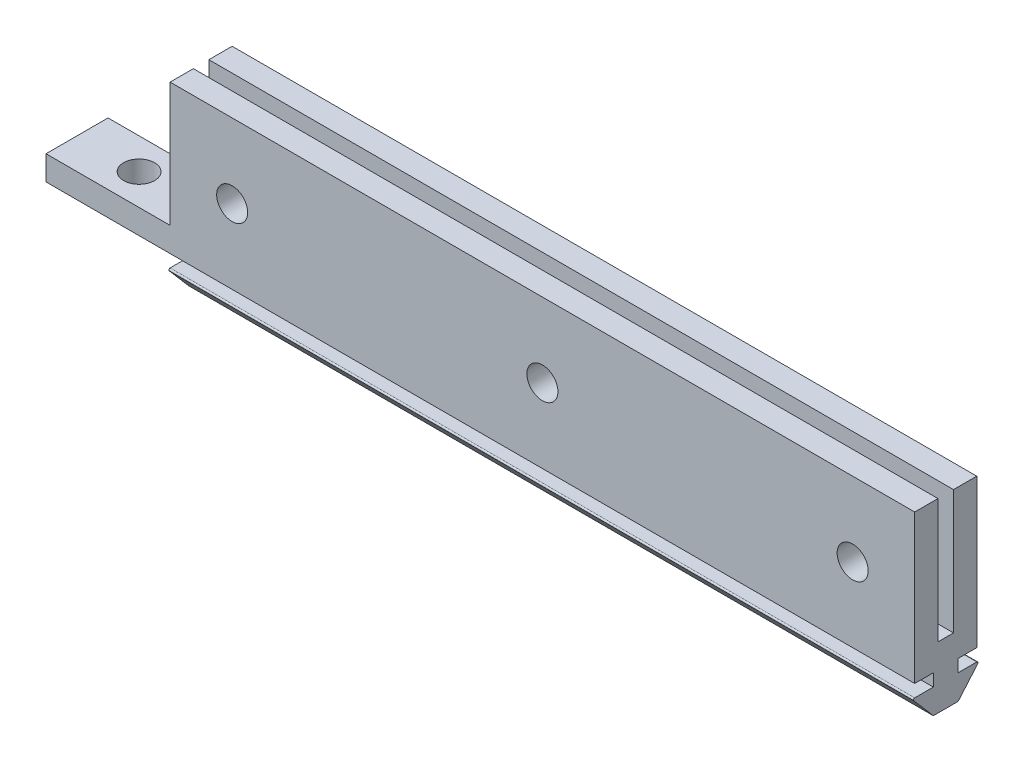
ISO-10303-21;
HEADER;
FILE_DESCRIPTION(('STEP AP214'),'2;1');
FILE_NAME('part.step','',(''),(''),'','','');
FILE_SCHEMA(('AUTOMOTIVE_DESIGN { 1 0 10303 214 1 1 1 1 }'));
ENDSEC;
DATA;
#1=APPLICATION_CONTEXT('core data for automotive mechanical design processes');
#2=APPLICATION_PROTOCOL_DEFINITION('international standard','automotive_design',2000,#1);
#3=PRODUCT_CONTEXT('',#1,'mechanical');
#4=PRODUCT('Part','Part','',(#3));
#5=PRODUCT_RELATED_PRODUCT_CATEGORY('part','',(#4));
#6=PRODUCT_DEFINITION_FORMATION('','',#4);
#7=PRODUCT_DEFINITION_CONTEXT('part definition',#1,'design');
#8=PRODUCT_DEFINITION('design','',#6,#7);
#9=PRODUCT_DEFINITION_SHAPE('','',#8);
#10=(LENGTH_UNIT() NAMED_UNIT(*) SI_UNIT(.MILLI.,.METRE.));
#11=(NAMED_UNIT(*) PLANE_ANGLE_UNIT() SI_UNIT($,.RADIAN.));
#12=(NAMED_UNIT(*) SI_UNIT($,.STERADIAN.) SOLID_ANGLE_UNIT());
#13=UNCERTAINTY_MEASURE_WITH_UNIT(LENGTH_MEASURE(1.E-05),#10,'distance_accuracy_value','');
#14=(GEOMETRIC_REPRESENTATION_CONTEXT(3) GLOBAL_UNCERTAINTY_ASSIGNED_CONTEXT((#13)) GLOBAL_UNIT_ASSIGNED_CONTEXT((#10,
#11,#12)) REPRESENTATION_CONTEXT('',''));
#15=CARTESIAN_POINT('',(0.,0.,0.));
#16=DIRECTION('',(0.,0.,1.));
#17=DIRECTION('',(1.,0.,0.));
#18=AXIS2_PLACEMENT_3D('',#15,#16,#17);
#19=CARTESIAN_POINT('',(-152.4,5.08,0.));
#20=DIRECTION('',(0.,1.,0.));
#21=DIRECTION('',(0.,0.,1.));
#22=AXIS2_PLACEMENT_3D('',#19,#20,#21);
#23=PLANE('',#22);
#24=DIRECTION('',(0.,0.,1.));
#25=VECTOR('',#24,1.);
#26=CARTESIAN_POINT('',(0.,5.08,0.));
#27=LINE('',#26,#25);
#28=CARTESIAN_POINT('',(0.,5.08,-2.54));
#29=VERTEX_POINT('',#28);
#30=CARTESIAN_POINT('',(0.,5.08,2.54));
#31=VERTEX_POINT('',#30);
#32=EDGE_CURVE('E169',#29,#31,#27,.T.);
#33=ORIENTED_EDGE('',*,*,#32,.T.);
#34=DIRECTION('',(1.,0.,0.));
#35=VECTOR('',#34,1.);
#36=CARTESIAN_POINT('',(-152.4,5.08,2.54));
#37=LINE('',#36,#35);
#38=CARTESIAN_POINT('',(-152.4,5.08,2.54));
#39=VERTEX_POINT('',#38);
#40=EDGE_CURVE('E52',#39,#31,#37,.T.);
#41=ORIENTED_EDGE('',*,*,#40,.F.);
#42=DIRECTION('',(0.,0.,1.));
#43=VECTOR('',#42,1.);
#44=CARTESIAN_POINT('',(-152.4,5.08,0.));
#45=LINE('',#44,#43);
#46=CARTESIAN_POINT('',(-152.4,5.08,-2.54));
#47=VERTEX_POINT('',#46);
#48=EDGE_CURVE('E69',#47,#39,#45,.T.);
#49=ORIENTED_EDGE('',*,*,#48,.F.);
#50=DIRECTION('',(1.,0.,0.));
#51=VECTOR('',#50,1.);
#52=CARTESIAN_POINT('',(-152.4,5.08,-2.54));
#53=LINE('',#52,#51);
#54=EDGE_CURVE('E168',#47,#29,#53,.T.);
#55=ORIENTED_EDGE('',*,*,#54,.T.);
#56=EDGE_LOOP('',(#33,#41,#49,#55));
#57=FACE_BOUND('',#56,.T.);
#58=ADVANCED_FACE('F43',(#57),#23,.F.);
#59=CARTESIAN_POINT('',(-152.4,0.90103385496104,-1.04911404967848));
#60=DIRECTION('',(0.,-0.651538564289137,0.758615514766241));
#61=DIRECTION('',(0.,-0.758615514766242,-0.651538564289137));
#62=AXIS2_PLACEMENT_3D('',#59,#60,#61);
#63=PLANE('',#62);
#64=DIRECTION('',(0.,-0.758615514766242,-0.651538564289137));
#65=VECTOR('',#64,1.);
#66=CARTESIAN_POINT('',(0.,0.90103385496104,-1.04911404967848));
#67=LINE('',#66,#65);
#68=CARTESIAN_POINT('',(0.,9.74050920467056,6.54268834075063));
#69=VERTEX_POINT('',#68);
#70=EDGE_CURVE('E196',#69,#31,#67,.T.);
#71=ORIENTED_EDGE('',*,*,#70,.F.);
#72=DIRECTION('',(1.,0.,0.));
#73=VECTOR('',#72,1.);
#74=CARTESIAN_POINT('',(-152.4,9.74050920467056,6.54268834075063));
#75=LINE('',#74,#73);
#76=CARTESIAN_POINT('',(-152.4,9.74050920467056,6.54268834075063));
#77=VERTEX_POINT('',#76);
#78=EDGE_CURVE('E146',#77,#69,#75,.T.);
#79=ORIENTED_EDGE('',*,*,#78,.F.);
#80=DIRECTION('',(0.,-0.758615514766242,-0.651538564289137));
#81=VECTOR('',#80,1.);
#82=CARTESIAN_POINT('',(-152.4,0.90103385496104,-1.04911404967848));
#83=LINE('',#82,#81);
#84=EDGE_CURVE('E154',#77,#39,#83,.T.);
#85=ORIENTED_EDGE('',*,*,#84,.T.);
#86=ORIENTED_EDGE('',*,*,#40,.T.);
#87=EDGE_LOOP('',(#71,#79,#85,#86));
#88=FACE_BOUND('',#87,.T.);
#89=ADVANCED_FACE('F395',(#88),#63,.T.);
#90=CARTESIAN_POINT('',(-152.4,9.906,6.35));
#91=DIRECTION('',(1.,0.,0.));
#92=DIRECTION('',(0.,0.,-1.));
#93=AXIS2_PLACEMENT_3D('',#90,#91,#92);
#94=CYLINDRICAL_SURFACE('',#93,0.254);
#95=CARTESIAN_POINT('',(0.,9.906,6.35));
#96=DIRECTION('',(1.,0.,0.));
#97=DIRECTION('',(0.,0.,-1.));
#98=AXIS2_PLACEMENT_3D('',#95,#96,#97);
#99=CIRCLE('',#98,0.254);
#100=CARTESIAN_POINT('',(0.,10.16,6.35));
#101=VERTEX_POINT('',#100);
#102=EDGE_CURVE('E140',#101,#69,#99,.T.);
#103=ORIENTED_EDGE('',*,*,#102,.F.);
#104=DIRECTION('',(1.,0.,0.));
#105=VECTOR('',#104,1.);
#106=CARTESIAN_POINT('',(-152.4,10.16,6.35));
#107=LINE('',#106,#105);
#108=CARTESIAN_POINT('',(-152.4,10.16,6.35));
#109=VERTEX_POINT('',#108);
#110=EDGE_CURVE('E135',#109,#101,#107,.T.);
#111=ORIENTED_EDGE('',*,*,#110,.F.);
#112=CARTESIAN_POINT('',(-152.4,9.906,6.35));
#113=DIRECTION('',(1.,0.,0.));
#114=DIRECTION('',(0.,0.,-1.));
#115=AXIS2_PLACEMENT_3D('',#112,#113,#114);
#116=CIRCLE('',#115,0.254);
#117=EDGE_CURVE('E138',#109,#77,#116,.T.);
#118=ORIENTED_EDGE('',*,*,#117,.T.);
#119=ORIENTED_EDGE('',*,*,#78,.T.);
#120=EDGE_LOOP('',(#103,#111,#118,#119));
#121=FACE_BOUND('',#120,.T.);
#122=ADVANCED_FACE('F137',(#121),#94,.T.);
#123=CARTESIAN_POINT('',(-152.4,10.16,0.));
#124=DIRECTION('',(0.,1.,0.));
#125=DIRECTION('',(0.,0.,1.));
#126=AXIS2_PLACEMENT_3D('',#123,#124,#125);
#127=PLANE('',#126);
#128=DIRECTION('',(0.,0.,1.));
#129=VECTOR('',#128,1.);
#130=CARTESIAN_POINT('',(0.,10.16,0.));
#131=LINE('',#130,#129);
#132=CARTESIAN_POINT('',(0.,10.16,2.54));
#133=VERTEX_POINT('',#132);
#134=EDGE_CURVE('E191',#133,#101,#131,.T.);
#135=ORIENTED_EDGE('',*,*,#134,.F.);
#136=DIRECTION('',(1.,0.,0.));
#137=VECTOR('',#136,1.);
#138=CARTESIAN_POINT('',(-152.4,10.16,2.54));
#139=LINE('',#138,#137);
#140=CARTESIAN_POINT('',(-152.4,10.16,2.54));
#141=VERTEX_POINT('',#140);
#142=EDGE_CURVE('E147',#141,#133,#139,.T.);
#143=ORIENTED_EDGE('',*,*,#142,.F.);
#144=DIRECTION('',(0.,0.,1.));
#145=VECTOR('',#144,1.);
#146=CARTESIAN_POINT('',(-152.4,10.16,0.));
#147=LINE('',#146,#145);
#148=EDGE_CURVE('E152',#141,#109,#147,.T.);
#149=ORIENTED_EDGE('',*,*,#148,.T.);
#150=ORIENTED_EDGE('',*,*,#110,.T.);
#151=EDGE_LOOP('',(#135,#143,#149,#150));
#152=FACE_BOUND('',#151,.T.);
#153=ADVANCED_FACE('F157',(#152),#127,.T.);
#154=CARTESIAN_POINT('',(-152.4,0.,2.54));
#155=DIRECTION('',(0.,0.,1.));
#156=DIRECTION('',(1.,0.,0.));
#157=AXIS2_PLACEMENT_3D('',#154,#155,#156);
#158=PLANE('',#157);
#159=DIRECTION('',(0.,-1.,0.));
#160=VECTOR('',#159,1.);
#161=CARTESIAN_POINT('',(0.,0.,2.54));
#162=LINE('',#161,#160);
#163=CARTESIAN_POINT('',(0.,12.7,2.54));
#164=VERTEX_POINT('',#163);
#165=EDGE_CURVE('E187',#164,#133,#162,.T.);
#166=ORIENTED_EDGE('',*,*,#165,.F.);
#167=DIRECTION('',(1.,0.,0.));
#168=VECTOR('',#167,1.);
#169=CARTESIAN_POINT('',(-152.4,12.7,2.54));
#170=LINE('',#169,#168);
#171=CARTESIAN_POINT('',(-152.4,12.7,2.54));
#172=VERTEX_POINT('',#171);
#173=EDGE_CURVE('E206',#172,#164,#170,.T.);
#174=ORIENTED_EDGE('',*,*,#173,.F.);
#175=DIRECTION('',(0.,-1.,0.));
#176=VECTOR('',#175,1.);
#177=CARTESIAN_POINT('',(-152.4,0.,2.54));
#178=LINE('',#177,#176);
#179=EDGE_CURVE('E159',#172,#141,#178,.T.);
#180=ORIENTED_EDGE('',*,*,#179,.T.);
#181=ORIENTED_EDGE('',*,*,#142,.T.);
#182=EDGE_LOOP('',(#166,#174,#180,#181));
#183=FACE_BOUND('',#182,.T.);
#184=ADVANCED_FACE('F400',(#183),#158,.T.);
#185=CARTESIAN_POINT('',(-152.4,0.,-2.54000000000001));
#186=DIRECTION('',(0.,0.,-1.));
#187=DIRECTION('',(0.,1.,0.));
#188=AXIS2_PLACEMENT_3D('',#185,#186,#187);
#189=PLANE('',#188);
#190=DIRECTION('',(0.,1.,0.));
#191=VECTOR('',#190,1.);
#192=CARTESIAN_POINT('',(0.,0.,-2.54000000000001));
#193=LINE('',#192,#191);
#194=CARTESIAN_POINT('',(0.,10.16,-2.54));
#195=VERTEX_POINT('',#194);
#196=CARTESIAN_POINT('',(0.,12.7,-2.54));
#197=VERTEX_POINT('',#196);
#198=EDGE_CURVE('E183',#195,#197,#193,.T.);
#199=ORIENTED_EDGE('',*,*,#198,.F.);
#200=DIRECTION('',(1.,0.,0.));
#201=VECTOR('',#200,1.);
#202=CARTESIAN_POINT('',(-152.4,10.16,-2.54));
#203=LINE('',#202,#201);
#204=CARTESIAN_POINT('',(-152.4,10.16,-2.54));
#205=VERTEX_POINT('',#204);
#206=EDGE_CURVE('E213',#205,#195,#203,.T.);
#207=ORIENTED_EDGE('',*,*,#206,.F.);
#208=DIRECTION('',(0.,1.,0.));
#209=VECTOR('',#208,1.);
#210=CARTESIAN_POINT('',(-152.4,0.,-2.54000000000001));
#211=LINE('',#210,#209);
#212=CARTESIAN_POINT('',(-152.4,12.7,-2.54));
#213=VERTEX_POINT('',#212);
#214=EDGE_CURVE('E367',#205,#213,#211,.T.);
#215=ORIENTED_EDGE('',*,*,#214,.T.);
#216=DIRECTION('',(1.,0.,0.));
#217=VECTOR('',#216,1.);
#218=CARTESIAN_POINT('',(-152.4,12.7,-2.54));
#219=LINE('',#218,#217);
#220=EDGE_CURVE('E210',#213,#197,#219,.T.);
#221=ORIENTED_EDGE('',*,*,#220,.T.);
#222=EDGE_LOOP('',(#199,#207,#215,#221));
#223=FACE_BOUND('',#222,.T.);
#224=ADVANCED_FACE('F381',(#223),#189,.T.);
#225=CARTESIAN_POINT('',(-152.4,10.16,0.));
#226=DIRECTION('',(0.,1.,0.));
#227=DIRECTION('',(0.,0.,1.));
#228=AXIS2_PLACEMENT_3D('',#225,#226,#227);
#229=PLANE('',#228);
#230=DIRECTION('',(0.,0.,1.));
#231=VECTOR('',#230,1.);
#232=CARTESIAN_POINT('',(0.,10.16,0.));
#233=LINE('',#232,#231);
#234=CARTESIAN_POINT('',(0.,10.16,-6.35));
#235=VERTEX_POINT('',#234);
#236=EDGE_CURVE('E179',#235,#195,#233,.T.);
#237=ORIENTED_EDGE('',*,*,#236,.F.);
#238=DIRECTION('',(1.,0.,0.));
#239=VECTOR('',#238,1.);
#240=CARTESIAN_POINT('',(-152.4,10.16,-6.35));
#241=LINE('',#240,#239);
#242=CARTESIAN_POINT('',(-152.4,10.16,-6.35));
#243=VERTEX_POINT('',#242);
#244=EDGE_CURVE('E216',#243,#235,#241,.T.);
#245=ORIENTED_EDGE('',*,*,#244,.F.);
#246=DIRECTION('',(0.,0.,1.));
#247=VECTOR('',#246,1.);
#248=CARTESIAN_POINT('',(-152.4,10.16,0.));
#249=LINE('',#248,#247);
#250=EDGE_CURVE('E363',#243,#205,#249,.T.);
#251=ORIENTED_EDGE('',*,*,#250,.T.);
#252=ORIENTED_EDGE('',*,*,#206,.T.);
#253=EDGE_LOOP('',(#237,#245,#251,#252));
#254=FACE_BOUND('',#253,.T.);
#255=ADVANCED_FACE('F384',(#254),#229,.T.);
#256=CARTESIAN_POINT('',(-152.4,9.906,-6.35));
#257=DIRECTION('',(1.,0.,0.));
#258=DIRECTION('',(0.,0.,-1.));
#259=AXIS2_PLACEMENT_3D('',#256,#257,#258);
#260=CYLINDRICAL_SURFACE('',#259,0.254000000000001);
#261=CARTESIAN_POINT('',(0.,9.906,-6.35));
#262=DIRECTION('',(1.,0.,0.));
#263=DIRECTION('',(0.,0.,-1.));
#264=AXIS2_PLACEMENT_3D('',#261,#262,#263);
#265=CIRCLE('',#264,0.254000000000001);
#266=CARTESIAN_POINT('',(0.,9.74050920467056,-6.54268834075063));
#267=VERTEX_POINT('',#266);
#268=EDGE_CURVE('E176',#235,#267,#265,.F.);
#269=ORIENTED_EDGE('',*,*,#268,.T.);
#270=DIRECTION('',(1.,0.,0.));
#271=VECTOR('',#270,1.);
#272=CARTESIAN_POINT('',(-152.4,9.74050920467056,-6.54268834075063));
#273=LINE('',#272,#271);
#274=CARTESIAN_POINT('',(-152.4,9.74050920467056,-6.54268834075063));
#275=VERTEX_POINT('',#274);
#276=EDGE_CURVE('E219',#275,#267,#273,.T.);
#277=ORIENTED_EDGE('',*,*,#276,.F.);
#278=CARTESIAN_POINT('',(-152.4,9.906,-6.35));
#279=DIRECTION('',(1.,0.,0.));
#280=DIRECTION('',(0.,0.,-1.));
#281=AXIS2_PLACEMENT_3D('',#278,#279,#280);
#282=CIRCLE('',#281,0.254000000000001);
#283=EDGE_CURVE('E360',#243,#275,#282,.F.);
#284=ORIENTED_EDGE('',*,*,#283,.F.);
#285=ORIENTED_EDGE('',*,*,#244,.T.);
#286=EDGE_LOOP('',(#269,#277,#284,#285));
#287=FACE_BOUND('',#286,.T.);
#288=ADVANCED_FACE('F388',(#287),#260,.T.);
#289=CARTESIAN_POINT('',(-152.4,0.90103385496104,1.04911404967848));
#290=DIRECTION('',(0.,0.651538564289137,0.758615514766241));
#291=DIRECTION('',(0.,-0.758615514766242,0.651538564289137));
#292=AXIS2_PLACEMENT_3D('',#289,#290,#291);
#293=PLANE('',#292);
#294=DIRECTION('',(0.,-0.758615514766242,0.651538564289137));
#295=VECTOR('',#294,1.);
#296=CARTESIAN_POINT('',(0.,0.90103385496104,1.04911404967848));
#297=LINE('',#296,#295);
#298=EDGE_CURVE('E172',#267,#29,#297,.T.);
#299=ORIENTED_EDGE('',*,*,#298,.T.);
#300=ORIENTED_EDGE('',*,*,#54,.F.);
#301=DIRECTION('',(0.,-0.758615514766242,0.651538564289137));
#302=VECTOR('',#301,1.);
#303=CARTESIAN_POINT('',(-152.4,0.90103385496104,1.04911404967848));
#304=LINE('',#303,#302);
#305=EDGE_CURVE('E111',#275,#47,#304,.T.);
#306=ORIENTED_EDGE('',*,*,#305,.F.);
#307=ORIENTED_EDGE('',*,*,#276,.T.);
#308=EDGE_LOOP('',(#299,#300,#306,#307));
#309=FACE_BOUND('',#308,.T.);
#310=ADVANCED_FACE('F392',(#309),#293,.F.);
#311=CARTESIAN_POINT('',(-152.4,0.,0.));
#312=DIRECTION('',(1.,0.,0.));
#313=DIRECTION('',(0.,0.,-1.));
#314=AXIS2_PLACEMENT_3D('',#311,#312,#313);
#315=PLANE('',#314);
#316=ORIENTED_EDGE('',*,*,#48,.T.);
#317=ORIENTED_EDGE('',*,*,#84,.F.);
#318=ORIENTED_EDGE('',*,*,#117,.F.);
#319=ORIENTED_EDGE('',*,*,#148,.F.);
#320=ORIENTED_EDGE('',*,*,#179,.F.);
#321=DIRECTION('',(0.,0.,1.));
#322=VECTOR('',#321,1.);
#323=CARTESIAN_POINT('',(-152.4,12.7,0.));
#324=LINE('',#323,#322);
#325=EDGE_CURVE('E162',#213,#172,#324,.T.);
#326=ORIENTED_EDGE('',*,*,#325,.F.);
#327=ORIENTED_EDGE('',*,*,#214,.F.);
#328=ORIENTED_EDGE('',*,*,#250,.F.);
#329=ORIENTED_EDGE('',*,*,#283,.T.);
#330=ORIENTED_EDGE('',*,*,#305,.T.);
#331=EDGE_LOOP('',(#316,#317,#318,#319,#320,#326,#327,#328,#329,#330));
#332=FACE_BOUND('',#331,.T.);
#333=ADVANCED_FACE('F150',(#332),#315,.F.);
#334=CARTESIAN_POINT('',(0.,0.,0.));
#335=DIRECTION('',(1.,0.,0.));
#336=DIRECTION('',(0.,0.,-1.));
#337=AXIS2_PLACEMENT_3D('',#334,#335,#336);
#338=PLANE('',#337);
#339=ORIENTED_EDGE('',*,*,#32,.F.);
#340=ORIENTED_EDGE('',*,*,#298,.F.);
#341=ORIENTED_EDGE('',*,*,#268,.F.);
#342=ORIENTED_EDGE('',*,*,#236,.T.);
#343=ORIENTED_EDGE('',*,*,#198,.T.);
#344=DIRECTION('',(0.,0.,-1.));
#345=VECTOR('',#344,1.);
#346=CARTESIAN_POINT('',(0.,12.7,-6.35));
#347=LINE('',#346,#345);
#348=CARTESIAN_POINT('',(0.,12.7,-6.35));
#349=VERTEX_POINT('',#348);
#350=EDGE_CURVE('E298',#197,#349,#347,.T.);
#351=ORIENTED_EDGE('',*,*,#350,.T.);
#352=DIRECTION('',(0.,1.,0.));
#353=VECTOR('',#352,1.);
#354=CARTESIAN_POINT('',(0.,43.1,-6.35));
#355=LINE('',#354,#353);
#356=CARTESIAN_POINT('',(0.,43.1,-6.35));
#357=VERTEX_POINT('',#356);
#358=EDGE_CURVE('E303',#349,#357,#355,.T.);
#359=ORIENTED_EDGE('',*,*,#358,.T.);
#360=DIRECTION('',(0.,0.,1.));
#361=VECTOR('',#360,1.);
#362=CARTESIAN_POINT('',(0.,43.1,-1.5875));
#363=LINE('',#362,#361);
#364=CARTESIAN_POINT('',(0.,43.1,-1.5875));
#365=VERTEX_POINT('',#364);
#366=EDGE_CURVE('E307',#357,#365,#363,.T.);
#367=ORIENTED_EDGE('',*,*,#366,.T.);
#368=DIRECTION('',(0.,-1.,0.));
#369=VECTOR('',#368,1.);
#370=CARTESIAN_POINT('',(0.,17.7,-1.5875));
#371=LINE('',#370,#369);
#372=CARTESIAN_POINT('',(0.,17.7,-1.5875));
#373=VERTEX_POINT('',#372);
#374=EDGE_CURVE('E311',#365,#373,#371,.T.);
#375=ORIENTED_EDGE('',*,*,#374,.T.);
#376=DIRECTION('',(0.,0.,1.));
#377=VECTOR('',#376,1.);
#378=CARTESIAN_POINT('',(0.,17.7,1.5875));
#379=LINE('',#378,#377);
#380=CARTESIAN_POINT('',(0.,17.7,1.5875));
#381=VERTEX_POINT('',#380);
#382=EDGE_CURVE('E315',#373,#381,#379,.T.);
#383=ORIENTED_EDGE('',*,*,#382,.T.);
#384=DIRECTION('',(0.,1.,0.));
#385=VECTOR('',#384,1.);
#386=CARTESIAN_POINT('',(0.,43.1,1.5875));
#387=LINE('',#386,#385);
#388=CARTESIAN_POINT('',(0.,43.1,1.5875));
#389=VERTEX_POINT('',#388);
#390=EDGE_CURVE('E319',#381,#389,#387,.T.);
#391=ORIENTED_EDGE('',*,*,#390,.T.);
#392=DIRECTION('',(0.,0.,1.));
#393=VECTOR('',#392,1.);
#394=CARTESIAN_POINT('',(0.,43.1,6.35));
#395=LINE('',#394,#393);
#396=CARTESIAN_POINT('',(0.,43.1,6.35));
#397=VERTEX_POINT('',#396);
#398=EDGE_CURVE('E280',#389,#397,#395,.T.);
#399=ORIENTED_EDGE('',*,*,#398,.T.);
#400=DIRECTION('',(0.,-1.,0.));
#401=VECTOR('',#400,1.);
#402=CARTESIAN_POINT('',(0.,12.7,6.35));
#403=LINE('',#402,#401);
#404=CARTESIAN_POINT('',(0.,12.7,6.35));
#405=VERTEX_POINT('',#404);
#406=EDGE_CURVE('E294',#397,#405,#403,.T.);
#407=ORIENTED_EDGE('',*,*,#406,.T.);
#408=EDGE_CURVE('E299',#405,#164,#347,.T.);
#409=ORIENTED_EDGE('',*,*,#408,.T.);
#410=ORIENTED_EDGE('',*,*,#165,.T.);
#411=ORIENTED_EDGE('',*,*,#134,.T.);
#412=ORIENTED_EDGE('',*,*,#102,.T.);
#413=ORIENTED_EDGE('',*,*,#70,.T.);
#414=EDGE_LOOP('',(#339,#340,#341,#342,#343,#351,#359,#367,#375,#383,#391,#399,#407,#409,#410,
#411,#412,#413));
#415=FACE_BOUND('',#414,.T.);
#416=ADVANCED_FACE('F397',(#415),#338,.T.);
#417=CARTESIAN_POINT('',(-236.146168214225,12.7,-6.35));
#418=DIRECTION('',(0.,-1.,0.));
#419=DIRECTION('',(0.,0.,-1.));
#420=AXIS2_PLACEMENT_3D('',#417,#418,#419);
#421=PLANE('',#420);
#422=CARTESIAN_POINT('',(-165.1,12.7,0.));
#423=DIRECTION('',(0.,-1.,0.));
#424=DIRECTION('',(0.,0.,-1.));
#425=AXIS2_PLACEMENT_3D('',#422,#423,#424);
#426=CIRCLE('',#425,3.17499999999998);
#427=CARTESIAN_POINT('',(-165.1,12.7,-3.17499999999998));
#428=VERTEX_POINT('',#427);
#429=EDGE_CURVE('E700',#428,#428,#426,.T.);
#430=ORIENTED_EDGE('',*,*,#429,.F.);
#431=EDGE_LOOP('',(#430));
#432=FACE_BOUND('',#431,.T.);
#433=ORIENTED_EDGE('',*,*,#220,.F.);
#434=ORIENTED_EDGE('',*,*,#325,.T.);
#435=ORIENTED_EDGE('',*,*,#173,.T.);
#436=ORIENTED_EDGE('',*,*,#408,.F.);
#437=DIRECTION('',(1.,0.,0.));
#438=VECTOR('',#437,1.);
#439=CARTESIAN_POINT('',(-236.146168214225,12.7,6.35));
#440=LINE('',#439,#438);
#441=CARTESIAN_POINT('',(-177.8,12.7,6.35));
#442=VERTEX_POINT('',#441);
#443=EDGE_CURVE('E347',#442,#405,#440,.T.);
#444=ORIENTED_EDGE('',*,*,#443,.F.);
#445=DIRECTION('',(0.,0.,1.));
#446=VECTOR('',#445,1.);
#447=CARTESIAN_POINT('',(-177.8,12.7,-6.35));
#448=LINE('',#447,#446);
#449=CARTESIAN_POINT('',(-177.8,12.7,-6.35));
#450=VERTEX_POINT('',#449);
#451=EDGE_CURVE('E281',#450,#442,#448,.T.);
#452=ORIENTED_EDGE('',*,*,#451,.F.);
#453=DIRECTION('',(1.,0.,0.));
#454=VECTOR('',#453,1.);
#455=CARTESIAN_POINT('',(-236.146168214225,12.7,-6.35));
#456=LINE('',#455,#454);
#457=EDGE_CURVE('E343',#450,#349,#456,.T.);
#458=ORIENTED_EDGE('',*,*,#457,.T.);
#459=ORIENTED_EDGE('',*,*,#350,.F.);
#460=EDGE_LOOP('',(#433,#434,#435,#436,#444,#452,#458,#459));
#461=FACE_BOUND('',#460,.T.);
#462=ADVANCED_FACE('F374',(#432,#461),#421,.T.);
#463=CARTESIAN_POINT('',(-236.146168214225,43.1,6.35));
#464=DIRECTION('',(0.,1.,0.));
#465=DIRECTION('',(0.,0.,1.));
#466=AXIS2_PLACEMENT_3D('',#463,#464,#465);
#467=PLANE('',#466);
#468=DIRECTION('',(0.,0.,-1.));
#469=VECTOR('',#468,1.);
#470=CARTESIAN_POINT('',(-152.4,43.1,6.604));
#471=LINE('',#470,#469);
#472=CARTESIAN_POINT('',(-152.4,43.1,6.35));
#473=VERTEX_POINT('',#472);
#474=CARTESIAN_POINT('',(-152.4,43.1,1.5875));
#475=VERTEX_POINT('',#474);
#476=EDGE_CURVE('E264',#473,#475,#471,.T.);
#477=ORIENTED_EDGE('',*,*,#476,.F.);
#478=DIRECTION('',(1.,0.,0.));
#479=VECTOR('',#478,1.);
#480=CARTESIAN_POINT('',(-236.146168214225,43.1,6.35));
#481=LINE('',#480,#479);
#482=EDGE_CURVE('E323',#473,#397,#481,.T.);
#483=ORIENTED_EDGE('',*,*,#482,.T.);
#484=ORIENTED_EDGE('',*,*,#398,.F.);
#485=DIRECTION('',(1.,0.,0.));
#486=VECTOR('',#485,1.);
#487=CARTESIAN_POINT('',(-236.146168214225,43.1,1.5875));
#488=LINE('',#487,#486);
#489=EDGE_CURVE('E286',#475,#389,#488,.T.);
#490=ORIENTED_EDGE('',*,*,#489,.F.);
#491=EDGE_LOOP('',(#477,#483,#484,#490));
#492=FACE_BOUND('',#491,.T.);
#493=ADVANCED_FACE('F486',(#492),#467,.T.);
#494=CARTESIAN_POINT('',(-236.146168214225,43.1,1.5875));
#495=DIRECTION('',(0.,0.,-1.));
#496=DIRECTION('',(0.,1.,0.));
#497=AXIS2_PLACEMENT_3D('',#494,#495,#496);
#498=PLANE('',#497);
#499=CARTESIAN_POINT('',(-12.7,27.9,1.5875));
#500=DIRECTION('',(0.,0.,-1.));
#501=DIRECTION('',(0.,1.,0.));
#502=AXIS2_PLACEMENT_3D('',#499,#500,#501);
#503=CIRCLE('',#502,3.175);
#504=CARTESIAN_POINT('',(-12.7,31.075,1.5875));
#505=VERTEX_POINT('',#504);
#506=EDGE_CURVE('E46',#505,#505,#503,.T.);
#507=ORIENTED_EDGE('',*,*,#506,.F.);
#508=EDGE_LOOP('',(#507));
#509=FACE_BOUND('',#508,.T.);
#510=CARTESIAN_POINT('',(-76.2,27.9,1.5875));
#511=DIRECTION('',(0.,0.,-1.));
#512=DIRECTION('',(0.,1.,0.));
#513=AXIS2_PLACEMENT_3D('',#510,#511,#512);
#514=CIRCLE('',#513,3.175);
#515=CARTESIAN_POINT('',(-76.2,31.075,1.5875));
#516=VERTEX_POINT('',#515);
#517=EDGE_CURVE('E244',#516,#516,#514,.T.);
#518=ORIENTED_EDGE('',*,*,#517,.F.);
#519=EDGE_LOOP('',(#518));
#520=FACE_BOUND('',#519,.T.);
#521=CARTESIAN_POINT('',(-139.7,27.9,1.5875));
#522=DIRECTION('',(0.,0.,-1.));
#523=DIRECTION('',(0.,1.,0.));
#524=AXIS2_PLACEMENT_3D('',#521,#522,#523);
#525=CIRCLE('',#524,3.175);
#526=CARTESIAN_POINT('',(-139.7,31.075,1.5875));
#527=VERTEX_POINT('',#526);
#528=EDGE_CURVE('E235',#527,#527,#525,.T.);
#529=ORIENTED_EDGE('',*,*,#528,.F.);
#530=EDGE_LOOP('',(#529));
#531=FACE_BOUND('',#530,.T.);
#532=DIRECTION('',(0.,-1.,0.));
#533=VECTOR('',#532,1.);
#534=CARTESIAN_POINT('',(-152.4,43.1,1.5875));
#535=LINE('',#534,#533);
#536=CARTESIAN_POINT('',(-152.4,17.7,1.5875));
#537=VERTEX_POINT('',#536);
#538=EDGE_CURVE('E276',#475,#537,#535,.T.);
#539=ORIENTED_EDGE('',*,*,#538,.F.);
#540=ORIENTED_EDGE('',*,*,#489,.T.);
#541=ORIENTED_EDGE('',*,*,#390,.F.);
#542=DIRECTION('',(1.,0.,0.));
#543=VECTOR('',#542,1.);
#544=CARTESIAN_POINT('',(-236.146168214225,17.7,1.5875));
#545=LINE('',#544,#543);
#546=EDGE_CURVE('E327',#537,#381,#545,.T.);
#547=ORIENTED_EDGE('',*,*,#546,.F.);
#548=EDGE_LOOP('',(#539,#540,#541,#547));
#549=FACE_BOUND('',#548,.T.);
#550=ADVANCED_FACE('F483',(#509,#520,#531,#549),#498,.T.);
#551=CARTESIAN_POINT('',(-236.146168214225,17.7,1.5875));
#552=DIRECTION('',(0.,1.,0.));
#553=DIRECTION('',(0.,0.,1.));
#554=AXIS2_PLACEMENT_3D('',#551,#552,#553);
#555=PLANE('',#554);
#556=CARTESIAN_POINT('',(-165.1,17.7,0.));
#557=DIRECTION('',(0.,1.,0.));
#558=DIRECTION('',(0.,0.,1.));
#559=AXIS2_PLACEMENT_3D('',#556,#557,#558);
#560=CIRCLE('',#559,3.17499999999998);
#561=CARTESIAN_POINT('',(-165.1,17.7,3.17499999999998));
#562=VERTEX_POINT('',#561);
#563=EDGE_CURVE('E703',#562,#562,#560,.T.);
#564=ORIENTED_EDGE('',*,*,#563,.F.);
#565=EDGE_LOOP('',(#564));
#566=FACE_BOUND('',#565,.T.);
#567=DIRECTION('',(1.,0.,0.));
#568=VECTOR('',#567,1.);
#569=CARTESIAN_POINT('',(-236.146168214225,17.7,-1.5875));
#570=LINE('',#569,#568);
#571=CARTESIAN_POINT('',(-152.4,17.7,-1.5875));
#572=VERTEX_POINT('',#571);
#573=EDGE_CURVE('E331',#572,#373,#570,.T.);
#574=ORIENTED_EDGE('',*,*,#573,.F.);
#575=DIRECTION('',(0.,0.,-1.));
#576=VECTOR('',#575,1.);
#577=CARTESIAN_POINT('',(-152.4,17.7,6.604));
#578=LINE('',#577,#576);
#579=CARTESIAN_POINT('',(-152.4,17.7,-6.35));
#580=VERTEX_POINT('',#579);
#581=EDGE_CURVE('E259',#572,#580,#578,.T.);
#582=ORIENTED_EDGE('',*,*,#581,.T.);
#583=DIRECTION('',(-1.,0.,0.));
#584=VECTOR('',#583,1.);
#585=CARTESIAN_POINT('',(-177.8,17.7,-6.35));
#586=LINE('',#585,#584);
#587=CARTESIAN_POINT('',(-177.8,17.7,-6.35));
#588=VERTEX_POINT('',#587);
#589=EDGE_CURVE('E255',#580,#588,#586,.T.);
#590=ORIENTED_EDGE('',*,*,#589,.T.);
#591=DIRECTION('',(0.,0.,-1.));
#592=VECTOR('',#591,1.);
#593=CARTESIAN_POINT('',(-177.8,17.7,1.5875));
#594=LINE('',#593,#592);
#595=CARTESIAN_POINT('',(-177.8,17.7,6.35));
#596=VERTEX_POINT('',#595);
#597=EDGE_CURVE('E60',#596,#588,#594,.T.);
#598=ORIENTED_EDGE('',*,*,#597,.F.);
#599=DIRECTION('',(1.,0.,0.));
#600=VECTOR('',#599,1.);
#601=CARTESIAN_POINT('',(-236.146168214225,17.7,6.35));
#602=LINE('',#601,#600);
#603=CARTESIAN_POINT('',(-152.4,17.7,6.35));
#604=VERTEX_POINT('',#603);
#605=EDGE_CURVE('E268',#596,#604,#602,.T.);
#606=ORIENTED_EDGE('',*,*,#605,.T.);
#607=EDGE_CURVE('E263',#604,#537,#578,.T.);
#608=ORIENTED_EDGE('',*,*,#607,.T.);
#609=ORIENTED_EDGE('',*,*,#546,.T.);
#610=ORIENTED_EDGE('',*,*,#382,.F.);
#611=EDGE_LOOP('',(#574,#582,#590,#598,#606,#608,#609,#610));
#612=FACE_BOUND('',#611,.T.);
#613=ADVANCED_FACE('F472',(#566,#612),#555,.T.);
#614=CARTESIAN_POINT('',(-236.146168214225,17.7,-1.5875));
#615=DIRECTION('',(0.,0.,1.));
#616=DIRECTION('',(0.,-1.,0.));
#617=AXIS2_PLACEMENT_3D('',#614,#615,#616);
#618=PLANE('',#617);
#619=CARTESIAN_POINT('',(-12.7,27.9,-1.5875));
#620=DIRECTION('',(0.,0.,1.));
#621=DIRECTION('',(0.,-1.,0.));
#622=AXIS2_PLACEMENT_3D('',#619,#620,#621);
#623=CIRCLE('',#622,3.175);
#624=CARTESIAN_POINT('',(-12.7,24.725,-1.5875));
#625=VERTEX_POINT('',#624);
#626=EDGE_CURVE('E554',#625,#625,#623,.T.);
#627=ORIENTED_EDGE('',*,*,#626,.F.);
#628=EDGE_LOOP('',(#627));
#629=FACE_BOUND('',#628,.T.);
#630=CARTESIAN_POINT('',(-76.2,27.9,-1.5875));
#631=DIRECTION('',(0.,0.,1.));
#632=DIRECTION('',(0.,-1.,0.));
#633=AXIS2_PLACEMENT_3D('',#630,#631,#632);
#634=CIRCLE('',#633,3.175);
#635=CARTESIAN_POINT('',(-76.2,24.725,-1.5875));
#636=VERTEX_POINT('',#635);
#637=EDGE_CURVE('E238',#636,#636,#634,.T.);
#638=ORIENTED_EDGE('',*,*,#637,.F.);
#639=EDGE_LOOP('',(#638));
#640=FACE_BOUND('',#639,.T.);
#641=CARTESIAN_POINT('',(-139.7,27.9,-1.5875));
#642=DIRECTION('',(0.,0.,1.));
#643=DIRECTION('',(0.,-1.,0.));
#644=AXIS2_PLACEMENT_3D('',#641,#642,#643);
#645=CIRCLE('',#644,3.175);
#646=CARTESIAN_POINT('',(-139.7,24.725,-1.5875));
#647=VERTEX_POINT('',#646);
#648=EDGE_CURVE('E228',#647,#647,#645,.T.);
#649=ORIENTED_EDGE('',*,*,#648,.F.);
#650=EDGE_LOOP('',(#649));
#651=FACE_BOUND('',#650,.T.);
#652=DIRECTION('',(0.,1.,0.));
#653=VECTOR('',#652,1.);
#654=CARTESIAN_POINT('',(-152.4,17.7,-1.5875));
#655=LINE('',#654,#653);
#656=CARTESIAN_POINT('',(-152.4,43.1,-1.5875));
#657=VERTEX_POINT('',#656);
#658=EDGE_CURVE('E272',#572,#657,#655,.T.);
#659=ORIENTED_EDGE('',*,*,#658,.F.);
#660=ORIENTED_EDGE('',*,*,#573,.T.);
#661=ORIENTED_EDGE('',*,*,#374,.F.);
#662=DIRECTION('',(1.,0.,0.));
#663=VECTOR('',#662,1.);
#664=CARTESIAN_POINT('',(-236.146168214225,43.1,-1.5875));
#665=LINE('',#664,#663);
#666=EDGE_CURVE('E335',#657,#365,#665,.T.);
#667=ORIENTED_EDGE('',*,*,#666,.F.);
#668=EDGE_LOOP('',(#659,#660,#661,#667));
#669=FACE_BOUND('',#668,.T.);
#670=ADVANCED_FACE('F489',(#629,#640,#651,#669),#618,.T.);
#671=CARTESIAN_POINT('',(-236.146168214225,43.1,-1.5875));
#672=DIRECTION('',(0.,1.,0.));
#673=DIRECTION('',(0.,0.,1.));
#674=AXIS2_PLACEMENT_3D('',#671,#672,#673);
#675=PLANE('',#674);
#676=CARTESIAN_POINT('',(-152.4,43.1,-6.35));
#677=VERTEX_POINT('',#676);
#678=EDGE_CURVE('E258',#657,#677,#471,.T.);
#679=ORIENTED_EDGE('',*,*,#678,.F.);
#680=ORIENTED_EDGE('',*,*,#666,.T.);
#681=ORIENTED_EDGE('',*,*,#366,.F.);
#682=DIRECTION('',(1.,0.,0.));
#683=VECTOR('',#682,1.);
#684=CARTESIAN_POINT('',(-236.146168214225,43.1,-6.35));
#685=LINE('',#684,#683);
#686=EDGE_CURVE('E339',#677,#357,#685,.T.);
#687=ORIENTED_EDGE('',*,*,#686,.F.);
#688=EDGE_LOOP('',(#679,#680,#681,#687));
#689=FACE_BOUND('',#688,.T.);
#690=ADVANCED_FACE('F456',(#689),#675,.T.);
#691=CARTESIAN_POINT('',(-236.146168214225,43.1,-6.35));
#692=DIRECTION('',(0.,0.,-1.));
#693=DIRECTION('',(-1.,0.,0.));
#694=AXIS2_PLACEMENT_3D('',#691,#692,#693);
#695=PLANE('',#694);
#696=CARTESIAN_POINT('',(-12.7,27.9,-6.35));
#697=DIRECTION('',(0.,0.,-1.));
#698=DIRECTION('',(-1.,0.,0.));
#699=AXIS2_PLACEMENT_3D('',#696,#697,#698);
#700=CIRCLE('',#699,3.175);
#701=CARTESIAN_POINT('',(-15.875,27.9,-6.35));
#702=VERTEX_POINT('',#701);
#703=EDGE_CURVE('E546',#702,#702,#700,.T.);
#704=ORIENTED_EDGE('',*,*,#703,.F.);
#705=EDGE_LOOP('',(#704));
#706=FACE_BOUND('',#705,.T.);
#707=CARTESIAN_POINT('',(-76.2,27.9,-6.35));
#708=DIRECTION('',(0.,0.,-1.));
#709=DIRECTION('',(-1.,0.,0.));
#710=AXIS2_PLACEMENT_3D('',#707,#708,#709);
#711=CIRCLE('',#710,3.175);
#712=CARTESIAN_POINT('',(-79.375,27.9,-6.35));
#713=VERTEX_POINT('',#712);
#714=EDGE_CURVE('E550',#713,#713,#711,.T.);
#715=ORIENTED_EDGE('',*,*,#714,.F.);
#716=EDGE_LOOP('',(#715));
#717=FACE_BOUND('',#716,.T.);
#718=CARTESIAN_POINT('',(-139.7,27.9,-6.35));
#719=DIRECTION('',(0.,0.,-1.));
#720=DIRECTION('',(-1.,0.,0.));
#721=AXIS2_PLACEMENT_3D('',#718,#719,#720);
#722=CIRCLE('',#721,3.17500000000001);
#723=CARTESIAN_POINT('',(-142.875,27.9,-6.35));
#724=VERTEX_POINT('',#723);
#725=EDGE_CURVE('E229',#724,#724,#722,.T.);
#726=ORIENTED_EDGE('',*,*,#725,.F.);
#727=EDGE_LOOP('',(#726));
#728=FACE_BOUND('',#727,.T.);
#729=ORIENTED_EDGE('',*,*,#589,.F.);
#730=DIRECTION('',(0.,-1.,0.));
#731=VECTOR('',#730,1.);
#732=CARTESIAN_POINT('',(-152.4,43.1,-6.35));
#733=LINE('',#732,#731);
#734=EDGE_CURVE('E251',#677,#580,#733,.T.);
#735=ORIENTED_EDGE('',*,*,#734,.F.);
#736=ORIENTED_EDGE('',*,*,#686,.T.);
#737=ORIENTED_EDGE('',*,*,#358,.F.);
#738=ORIENTED_EDGE('',*,*,#457,.F.);
#739=DIRECTION('',(0.,-1.,0.));
#740=VECTOR('',#739,1.);
#741=CARTESIAN_POINT('',(-177.8,43.1,-6.35));
#742=LINE('',#741,#740);
#743=EDGE_CURVE('E285',#588,#450,#742,.T.);
#744=ORIENTED_EDGE('',*,*,#743,.F.);
#745=EDGE_LOOP('',(#729,#735,#736,#737,#738,#744));
#746=FACE_BOUND('',#745,.T.);
#747=ADVANCED_FACE('F453',(#706,#717,#728,#746),#695,.T.);
#748=CARTESIAN_POINT('',(-236.146168214225,12.7,6.35));
#749=DIRECTION('',(0.,0.,1.));
#750=DIRECTION('',(1.,0.,0.));
#751=AXIS2_PLACEMENT_3D('',#748,#749,#750);
#752=PLANE('',#751);
#753=CARTESIAN_POINT('',(-12.7,27.9,6.35));
#754=DIRECTION('',(0.,0.,1.));
#755=DIRECTION('',(1.,0.,0.));
#756=AXIS2_PLACEMENT_3D('',#753,#754,#755);
#757=CIRCLE('',#756,3.175);
#758=CARTESIAN_POINT('',(-9.525,27.9,6.35));
#759=VERTEX_POINT('',#758);
#760=EDGE_CURVE('E561',#759,#759,#757,.T.);
#761=ORIENTED_EDGE('',*,*,#760,.F.);
#762=EDGE_LOOP('',(#761));
#763=FACE_BOUND('',#762,.T.);
#764=CARTESIAN_POINT('',(-76.2,27.9,6.35));
#765=DIRECTION('',(0.,0.,1.));
#766=DIRECTION('',(1.,0.,0.));
#767=AXIS2_PLACEMENT_3D('',#764,#765,#766);
#768=CIRCLE('',#767,3.175);
#769=CARTESIAN_POINT('',(-73.025,27.9,6.35));
#770=VERTEX_POINT('',#769);
#771=EDGE_CURVE('E553',#770,#770,#768,.T.);
#772=ORIENTED_EDGE('',*,*,#771,.F.);
#773=EDGE_LOOP('',(#772));
#774=FACE_BOUND('',#773,.T.);
#775=CARTESIAN_POINT('',(-139.7,27.9,6.35));
#776=DIRECTION('',(0.,0.,1.));
#777=DIRECTION('',(1.,0.,0.));
#778=AXIS2_PLACEMENT_3D('',#775,#776,#777);
#779=CIRCLE('',#778,3.175);
#780=CARTESIAN_POINT('',(-136.525,27.9,6.35));
#781=VERTEX_POINT('',#780);
#782=EDGE_CURVE('E225',#781,#781,#779,.T.);
#783=ORIENTED_EDGE('',*,*,#782,.F.);
#784=EDGE_LOOP('',(#783));
#785=FACE_BOUND('',#784,.T.);
#786=ORIENTED_EDGE('',*,*,#605,.F.);
#787=DIRECTION('',(0.,1.,0.));
#788=VECTOR('',#787,1.);
#789=CARTESIAN_POINT('',(-177.8,12.7,6.35));
#790=LINE('',#789,#788);
#791=EDGE_CURVE('E173',#442,#596,#790,.T.);
#792=ORIENTED_EDGE('',*,*,#791,.F.);
#793=ORIENTED_EDGE('',*,*,#443,.T.);
#794=ORIENTED_EDGE('',*,*,#406,.F.);
#795=ORIENTED_EDGE('',*,*,#482,.F.);
#796=DIRECTION('',(0.,1.,0.));
#797=VECTOR('',#796,1.);
#798=CARTESIAN_POINT('',(-152.4,12.7,6.35));
#799=LINE('',#798,#797);
#800=EDGE_CURVE('E12',#604,#473,#799,.T.);
#801=ORIENTED_EDGE('',*,*,#800,.F.);
#802=EDGE_LOOP('',(#786,#792,#793,#794,#795,#801));
#803=FACE_BOUND('',#802,.T.);
#804=ADVANCED_FACE('F464',(#763,#774,#785,#803),#752,.T.);
#805=CARTESIAN_POINT('',(-177.8,0.,0.));
#806=DIRECTION('',(1.,0.,0.));
#807=DIRECTION('',(0.,0.,-1.));
#808=AXIS2_PLACEMENT_3D('',#805,#806,#807);
#809=PLANE('',#808);
#810=ORIENTED_EDGE('',*,*,#791,.T.);
#811=ORIENTED_EDGE('',*,*,#597,.T.);
#812=ORIENTED_EDGE('',*,*,#743,.T.);
#813=ORIENTED_EDGE('',*,*,#451,.T.);
#814=EDGE_LOOP('',(#810,#811,#812,#813));
#815=FACE_BOUND('',#814,.T.);
#816=ADVANCED_FACE('F461',(#815),#809,.F.);
#817=CARTESIAN_POINT('',(-152.4,43.1,6.604));
#818=DIRECTION('',(1.,0.,0.));
#819=DIRECTION('',(0.,0.,-1.));
#820=AXIS2_PLACEMENT_3D('',#817,#818,#819);
#821=PLANE('',#820);
#822=ORIENTED_EDGE('',*,*,#658,.T.);
#823=ORIENTED_EDGE('',*,*,#678,.T.);
#824=ORIENTED_EDGE('',*,*,#734,.T.);
#825=ORIENTED_EDGE('',*,*,#581,.F.);
#826=EDGE_LOOP('',(#822,#823,#824,#825));
#827=FACE_BOUND('',#826,.T.);
#828=ADVANCED_FACE('F446',(#827),#821,.F.);
#829=ORIENTED_EDGE('',*,*,#538,.T.);
#830=ORIENTED_EDGE('',*,*,#607,.F.);
#831=ORIENTED_EDGE('',*,*,#800,.T.);
#832=ORIENTED_EDGE('',*,*,#476,.T.);
#833=EDGE_LOOP('',(#829,#830,#831,#832));
#834=FACE_BOUND('',#833,.T.);
#835=ADVANCED_FACE('F475',(#834),#821,.F.);
#836=CARTESIAN_POINT('',(-139.7,27.9,-6.35));
#837=DIRECTION('',(0.,0.,-1.));
#838=DIRECTION('',(-1.,0.,0.));
#839=AXIS2_PLACEMENT_3D('',#836,#837,#838);
#840=CYLINDRICAL_SURFACE('',#839,3.175);
#841=ORIENTED_EDGE('',*,*,#528,.T.);
#842=EDGE_LOOP('',(#841));
#843=FACE_BOUND('',#842,.T.);
#844=ORIENTED_EDGE('',*,*,#782,.T.);
#845=EDGE_LOOP('',(#844));
#846=FACE_BOUND('',#845,.T.);
#847=ADVANCED_FACE('F577',(#843,#846),#840,.F.);
#848=ORIENTED_EDGE('',*,*,#648,.T.);
#849=EDGE_LOOP('',(#848));
#850=FACE_BOUND('',#849,.T.);
#851=ORIENTED_EDGE('',*,*,#725,.T.);
#852=EDGE_LOOP('',(#851));
#853=FACE_BOUND('',#852,.T.);
#854=ADVANCED_FACE('F579',(#850,#853),#840,.F.);
#855=CARTESIAN_POINT('',(-76.2,27.9,-6.35));
#856=DIRECTION('',(0.,0.,-1.));
#857=DIRECTION('',(-1.,0.,0.));
#858=AXIS2_PLACEMENT_3D('',#855,#856,#857);
#859=CYLINDRICAL_SURFACE('',#858,3.175);
#860=ORIENTED_EDGE('',*,*,#637,.T.);
#861=EDGE_LOOP('',(#860));
#862=FACE_BOUND('',#861,.T.);
#863=ORIENTED_EDGE('',*,*,#714,.T.);
#864=EDGE_LOOP('',(#863));
#865=FACE_BOUND('',#864,.T.);
#866=ADVANCED_FACE('F585',(#862,#865),#859,.F.);
#867=ORIENTED_EDGE('',*,*,#517,.T.);
#868=EDGE_LOOP('',(#867));
#869=FACE_BOUND('',#868,.T.);
#870=ORIENTED_EDGE('',*,*,#771,.T.);
#871=EDGE_LOOP('',(#870));
#872=FACE_BOUND('',#871,.T.);
#873=ADVANCED_FACE('F568',(#869,#872),#859,.F.);
#874=CARTESIAN_POINT('',(-12.7,27.9,-6.35));
#875=DIRECTION('',(0.,0.,-1.));
#876=DIRECTION('',(-1.,0.,0.));
#877=AXIS2_PLACEMENT_3D('',#874,#875,#876);
#878=CYLINDRICAL_SURFACE('',#877,3.175);
#879=ORIENTED_EDGE('',*,*,#760,.T.);
#880=EDGE_LOOP('',(#879));
#881=FACE_BOUND('',#880,.T.);
#882=ORIENTED_EDGE('',*,*,#506,.T.);
#883=EDGE_LOOP('',(#882));
#884=FACE_BOUND('',#883,.T.);
#885=ADVANCED_FACE('F654',(#881,#884),#878,.F.);
#886=ORIENTED_EDGE('',*,*,#626,.T.);
#887=EDGE_LOOP('',(#886));
#888=FACE_BOUND('',#887,.T.);
#889=ORIENTED_EDGE('',*,*,#703,.T.);
#890=EDGE_LOOP('',(#889));
#891=FACE_BOUND('',#890,.T.);
#892=ADVANCED_FACE('F662',(#888,#891),#878,.F.);
#893=CARTESIAN_POINT('',(-165.1,17.7,0.));
#894=DIRECTION('',(0.,1.,0.));
#895=DIRECTION('',(0.,0.,1.));
#896=AXIS2_PLACEMENT_3D('',#893,#894,#895);
#897=CYLINDRICAL_SURFACE('',#896,3.17499999999998);
#898=ORIENTED_EDGE('',*,*,#429,.T.);
#899=EDGE_LOOP('',(#898));
#900=FACE_BOUND('',#899,.T.);
#901=ORIENTED_EDGE('',*,*,#563,.T.);
#902=EDGE_LOOP('',(#901));
#903=FACE_BOUND('',#902,.T.);
#904=ADVANCED_FACE('F671',(#900,#903),#897,.F.);
#905=CLOSED_SHELL('',(#58,#89,#122,#153,#184,#224,#255,#288,#310,#333,#416,#462,#493,#550,#613,
#670,#690,#747,#804,#816,#828,#835,#847,#854,#866,#873,#885,#892,#904));
#906=MANIFOLD_SOLID_BREP('B2',#905);
#907=ADVANCED_BREP_SHAPE_REPRESENTATION('',(#18,#906),#14);
#908=SHAPE_DEFINITION_REPRESENTATION(#9,#907);
ENDSEC;
END-ISO-10303-21;
